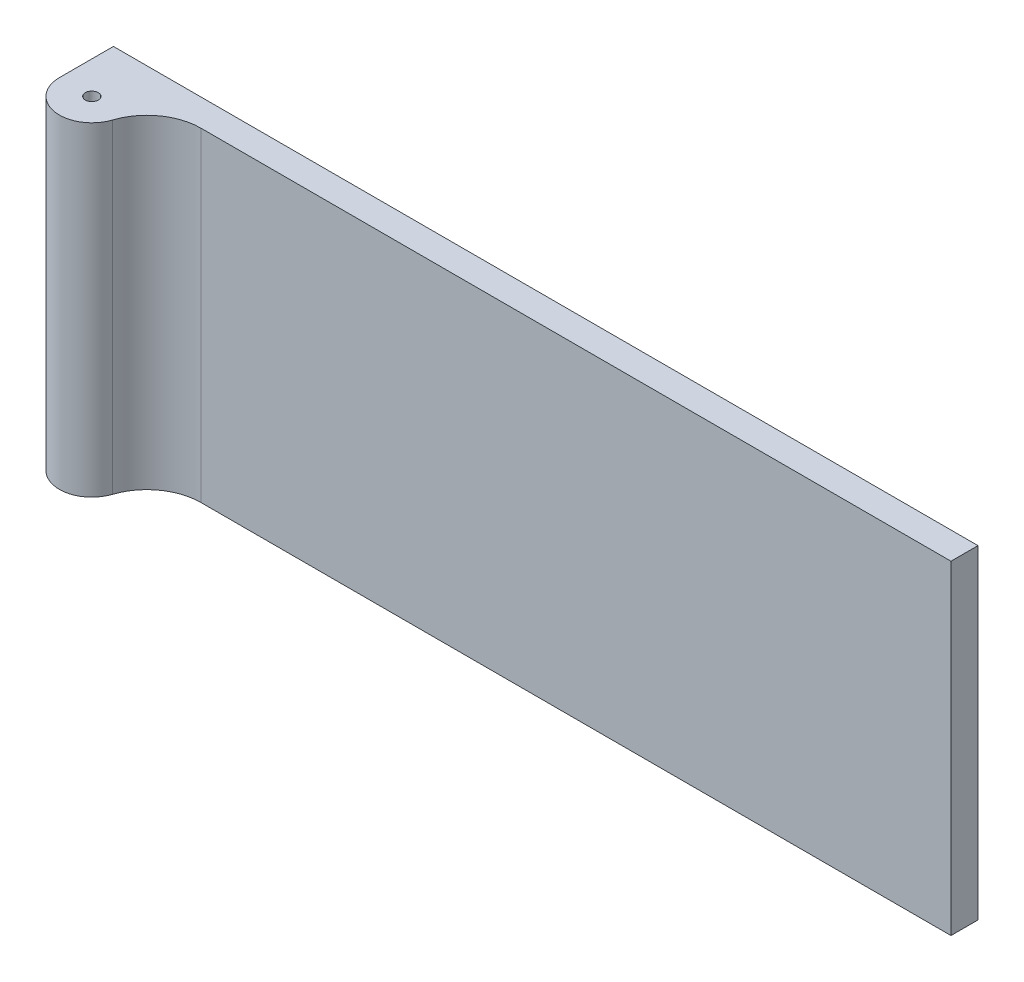
ISO-10303-21;
HEADER;
FILE_DESCRIPTION(('STEP AP214'),'2;1');
FILE_NAME('part.step','',(''),(''),'','','');
FILE_SCHEMA(('AUTOMOTIVE_DESIGN { 1 0 10303 214 1 1 1 1 }'));
ENDSEC;
DATA;
#1=APPLICATION_CONTEXT('core data for automotive mechanical design processes');
#2=APPLICATION_PROTOCOL_DEFINITION('international standard','automotive_design',2000,#1);
#3=PRODUCT_CONTEXT('',#1,'mechanical');
#4=PRODUCT('Part','Part','',(#3));
#5=PRODUCT_RELATED_PRODUCT_CATEGORY('part','',(#4));
#6=PRODUCT_DEFINITION_FORMATION('','',#4);
#7=PRODUCT_DEFINITION_CONTEXT('part definition',#1,'design');
#8=PRODUCT_DEFINITION('design','',#6,#7);
#9=PRODUCT_DEFINITION_SHAPE('','',#8);
#10=(LENGTH_UNIT() NAMED_UNIT(*) SI_UNIT(.MILLI.,.METRE.));
#11=(NAMED_UNIT(*) PLANE_ANGLE_UNIT() SI_UNIT($,.RADIAN.));
#12=(NAMED_UNIT(*) SI_UNIT($,.STERADIAN.) SOLID_ANGLE_UNIT());
#13=UNCERTAINTY_MEASURE_WITH_UNIT(LENGTH_MEASURE(1.E-05),#10,'distance_accuracy_value','');
#14=(GEOMETRIC_REPRESENTATION_CONTEXT(3) GLOBAL_UNCERTAINTY_ASSIGNED_CONTEXT((#13)) GLOBAL_UNIT_ASSIGNED_CONTEXT((#10,
#11,#12)) REPRESENTATION_CONTEXT('',''));
#15=CARTESIAN_POINT('',(0.,0.,0.));
#16=DIRECTION('',(0.,0.,1.));
#17=DIRECTION('',(1.,0.,0.));
#18=AXIS2_PLACEMENT_3D('',#15,#16,#17);
#19=CARTESIAN_POINT('',(0.,30.,0.));
#20=DIRECTION('',(1.,0.,0.));
#21=DIRECTION('',(0.,0.,-1.));
#22=AXIS2_PLACEMENT_3D('',#19,#20,#21);
#23=PLANE('',#22);
#24=DIRECTION('',(0.,0.,1.));
#25=VECTOR('',#24,1.);
#26=CARTESIAN_POINT('',(0.,0.,0.));
#27=LINE('',#26,#25);
#28=CARTESIAN_POINT('',(0.,0.,0.));
#29=VERTEX_POINT('',#28);
#30=CARTESIAN_POINT('',(0.,0.,5.));
#31=VERTEX_POINT('',#30);
#32=EDGE_CURVE('E106',#29,#31,#27,.T.);
#33=ORIENTED_EDGE('',*,*,#32,.T.);
#34=DIRECTION('',(0.,-1.,0.));
#35=VECTOR('',#34,1.);
#36=CARTESIAN_POINT('',(0.,30.,5.));
#37=LINE('',#36,#35);
#38=CARTESIAN_POINT('',(0.,30.,5.));
#39=VERTEX_POINT('',#38);
#40=EDGE_CURVE('E88',#39,#31,#37,.T.);
#41=ORIENTED_EDGE('',*,*,#40,.F.);
#42=DIRECTION('',(0.,0.,1.));
#43=VECTOR('',#42,1.);
#44=CARTESIAN_POINT('',(0.,30.,0.));
#45=LINE('',#44,#43);
#46=CARTESIAN_POINT('',(0.,30.,0.));
#47=VERTEX_POINT('',#46);
#48=EDGE_CURVE('E93',#47,#39,#45,.T.);
#49=ORIENTED_EDGE('',*,*,#48,.F.);
#50=DIRECTION('',(0.,-1.,0.));
#51=VECTOR('',#50,1.);
#52=CARTESIAN_POINT('',(0.,30.,0.));
#53=LINE('',#52,#51);
#54=EDGE_CURVE('E118',#47,#29,#53,.T.);
#55=ORIENTED_EDGE('',*,*,#54,.T.);
#56=EDGE_LOOP('',(#33,#41,#49,#55));
#57=FACE_BOUND('',#56,.T.);
#58=ADVANCED_FACE('F35',(#57),#23,.F.);
#59=CARTESIAN_POINT('',(3.,30.,5.));
#60=DIRECTION('',(0.,-1.,0.));
#61=DIRECTION('',(0.,0.,-1.));
#62=AXIS2_PLACEMENT_3D('',#59,#60,#61);
#63=CYLINDRICAL_SURFACE('',#62,3.);
#64=CARTESIAN_POINT('',(3.,0.,5.));
#65=DIRECTION('',(0.,1.,0.));
#66=DIRECTION('',(0.,0.,1.));
#67=AXIS2_PLACEMENT_3D('',#64,#65,#66);
#68=CIRCLE('',#67,3.);
#69=CARTESIAN_POINT('',(5.8497532787945,0.,5.9375));
#70=VERTEX_POINT('',#69);
#71=EDGE_CURVE('E131',#31,#70,#68,.T.);
#72=ORIENTED_EDGE('',*,*,#71,.T.);
#73=DIRECTION('',(0.,-1.,0.));
#74=VECTOR('',#73,1.);
#75=CARTESIAN_POINT('',(5.8497532787945,30.,5.9375));
#76=LINE('',#75,#74);
#77=CARTESIAN_POINT('',(5.8497532787945,30.,5.9375));
#78=VERTEX_POINT('',#77);
#79=EDGE_CURVE('E50',#70,#78,#76,.F.);
#80=ORIENTED_EDGE('',*,*,#79,.T.);
#81=CARTESIAN_POINT('',(3.,30.,5.));
#82=DIRECTION('',(0.,1.,0.));
#83=DIRECTION('',(0.,0.,1.));
#84=AXIS2_PLACEMENT_3D('',#81,#82,#83);
#85=CIRCLE('',#84,3.);
#86=EDGE_CURVE('E84',#39,#78,#85,.T.);
#87=ORIENTED_EDGE('',*,*,#86,.F.);
#88=ORIENTED_EDGE('',*,*,#40,.T.);
#89=EDGE_LOOP('',(#72,#80,#87,#88));
#90=FACE_BOUND('',#89,.T.);
#91=ADVANCED_FACE('F86',(#90),#63,.T.);
#92=CARTESIAN_POINT('',(0.,30.,2.5));
#93=DIRECTION('',(0.,0.,-1.));
#94=DIRECTION('',(-1.,0.,0.));
#95=AXIS2_PLACEMENT_3D('',#92,#93,#94);
#96=PLANE('',#95);
#97=DIRECTION('',(1.,0.,0.));
#98=VECTOR('',#97,1.);
#99=CARTESIAN_POINT('',(0.,30.,2.5));
#100=LINE('',#99,#98);
#101=CARTESIAN_POINT('',(10.5993420767853,30.,2.5));
#102=VERTEX_POINT('',#101);
#103=CARTESIAN_POINT('',(80.,30.,2.5));
#104=VERTEX_POINT('',#103);
#105=EDGE_CURVE('E92',#102,#104,#100,.T.);
#106=ORIENTED_EDGE('',*,*,#105,.F.);
#107=DIRECTION('',(0.,1.,0.));
#108=VECTOR('',#107,1.);
#109=CARTESIAN_POINT('',(10.5993420767853,0.,2.5));
#110=LINE('',#109,#108);
#111=CARTESIAN_POINT('',(10.5993420767853,0.,2.5));
#112=VERTEX_POINT('',#111);
#113=EDGE_CURVE('E107',#102,#112,#110,.F.);
#114=ORIENTED_EDGE('',*,*,#113,.T.);
#115=DIRECTION('',(1.,0.,0.));
#116=VECTOR('',#115,1.);
#117=CARTESIAN_POINT('',(0.,0.,2.5));
#118=LINE('',#117,#116);
#119=CARTESIAN_POINT('',(80.,0.,2.5));
#120=VERTEX_POINT('',#119);
#121=EDGE_CURVE('E129',#112,#120,#118,.T.);
#122=ORIENTED_EDGE('',*,*,#121,.T.);
#123=DIRECTION('',(0.,-1.,0.));
#124=VECTOR('',#123,1.);
#125=CARTESIAN_POINT('',(80.,30.,2.5));
#126=LINE('',#125,#124);
#127=EDGE_CURVE('E108',#104,#120,#126,.T.);
#128=ORIENTED_EDGE('',*,*,#127,.F.);
#129=EDGE_LOOP('',(#106,#114,#122,#128));
#130=FACE_BOUND('',#129,.T.);
#131=ADVANCED_FACE('F144',(#130),#96,.F.);
#132=CARTESIAN_POINT('',(80.,30.,0.));
#133=DIRECTION('',(1.,0.,0.));
#134=DIRECTION('',(0.,0.,-1.));
#135=AXIS2_PLACEMENT_3D('',#132,#133,#134);
#136=PLANE('',#135);
#137=DIRECTION('',(0.,0.,1.));
#138=VECTOR('',#137,1.);
#139=CARTESIAN_POINT('',(80.,0.,0.));
#140=LINE('',#139,#138);
#141=CARTESIAN_POINT('',(80.,0.,0.));
#142=VERTEX_POINT('',#141);
#143=EDGE_CURVE('E126',#142,#120,#140,.T.);
#144=ORIENTED_EDGE('',*,*,#143,.F.);
#145=DIRECTION('',(0.,-1.,0.));
#146=VECTOR('',#145,1.);
#147=CARTESIAN_POINT('',(80.,30.,0.));
#148=LINE('',#147,#146);
#149=CARTESIAN_POINT('',(80.,30.,0.));
#150=VERTEX_POINT('',#149);
#151=EDGE_CURVE('E113',#150,#142,#148,.T.);
#152=ORIENTED_EDGE('',*,*,#151,.F.);
#153=DIRECTION('',(0.,0.,1.));
#154=VECTOR('',#153,1.);
#155=CARTESIAN_POINT('',(80.,30.,0.));
#156=LINE('',#155,#154);
#157=EDGE_CURVE('E137',#150,#104,#156,.T.);
#158=ORIENTED_EDGE('',*,*,#157,.T.);
#159=ORIENTED_EDGE('',*,*,#127,.T.);
#160=EDGE_LOOP('',(#144,#152,#158,#159));
#161=FACE_BOUND('',#160,.T.);
#162=ADVANCED_FACE('F147',(#161),#136,.T.);
#163=CARTESIAN_POINT('',(0.,30.,0.));
#164=DIRECTION('',(0.,0.,-1.));
#165=DIRECTION('',(-1.,0.,0.));
#166=AXIS2_PLACEMENT_3D('',#163,#164,#165);
#167=PLANE('',#166);
#168=DIRECTION('',(1.,0.,0.));
#169=VECTOR('',#168,1.);
#170=CARTESIAN_POINT('',(0.,0.,0.));
#171=LINE('',#170,#169);
#172=EDGE_CURVE('E123',#29,#142,#171,.T.);
#173=ORIENTED_EDGE('',*,*,#172,.F.);
#174=ORIENTED_EDGE('',*,*,#54,.F.);
#175=DIRECTION('',(1.,0.,0.));
#176=VECTOR('',#175,1.);
#177=CARTESIAN_POINT('',(0.,30.,0.));
#178=LINE('',#177,#176);
#179=EDGE_CURVE('E101',#47,#150,#178,.T.);
#180=ORIENTED_EDGE('',*,*,#179,.T.);
#181=ORIENTED_EDGE('',*,*,#151,.T.);
#182=EDGE_LOOP('',(#173,#174,#180,#181));
#183=FACE_BOUND('',#182,.T.);
#184=ADVANCED_FACE('F150',(#183),#167,.T.);
#185=CARTESIAN_POINT('',(3.,30.,5.));
#186=DIRECTION('',(0.,-1.,0.));
#187=DIRECTION('',(0.,0.,-1.));
#188=AXIS2_PLACEMENT_3D('',#185,#186,#187);
#189=CYLINDRICAL_SURFACE('',#188,0.6);
#190=CARTESIAN_POINT('',(3.,30.,5.));
#191=DIRECTION('',(0.,1.,0.));
#192=DIRECTION('',(0.,0.,1.));
#193=AXIS2_PLACEMENT_3D('',#190,#191,#192);
#194=CIRCLE('',#193,0.6);
#195=CARTESIAN_POINT('',(3.,30.,5.6));
#196=VERTEX_POINT('',#195);
#197=EDGE_CURVE('E120',#196,#196,#194,.T.);
#198=ORIENTED_EDGE('',*,*,#197,.T.);
#199=EDGE_LOOP('',(#198));
#200=FACE_BOUND('',#199,.T.);
#201=CARTESIAN_POINT('',(3.,0.,5.));
#202=DIRECTION('',(0.,1.,0.));
#203=DIRECTION('',(0.,0.,1.));
#204=AXIS2_PLACEMENT_3D('',#201,#202,#203);
#205=CIRCLE('',#204,0.6);
#206=CARTESIAN_POINT('',(3.,0.,5.6));
#207=VERTEX_POINT('',#206);
#208=EDGE_CURVE('E103',#207,#207,#205,.T.);
#209=ORIENTED_EDGE('',*,*,#208,.F.);
#210=EDGE_LOOP('',(#209));
#211=FACE_BOUND('',#210,.T.);
#212=ADVANCED_FACE('F171',(#200,#211),#189,.F.);
#213=CARTESIAN_POINT('',(0.,30.,0.));
#214=DIRECTION('',(0.,1.,0.));
#215=DIRECTION('',(0.,0.,1.));
#216=AXIS2_PLACEMENT_3D('',#213,#214,#215);
#217=PLANE('',#216);
#218=ORIENTED_EDGE('',*,*,#48,.T.);
#219=ORIENTED_EDGE('',*,*,#86,.T.);
#220=CARTESIAN_POINT('',(10.5993420767853,30.,7.5));
#221=DIRECTION('',(0.,1.,0.));
#222=DIRECTION('',(0.,0.,1.));
#223=AXIS2_PLACEMENT_3D('',#220,#221,#222);
#224=CIRCLE('',#223,5.);
#225=EDGE_CURVE('E11',#78,#102,#224,.F.);
#226=ORIENTED_EDGE('',*,*,#225,.T.);
#227=ORIENTED_EDGE('',*,*,#105,.T.);
#228=ORIENTED_EDGE('',*,*,#157,.F.);
#229=ORIENTED_EDGE('',*,*,#179,.F.);
#230=EDGE_LOOP('',(#218,#219,#226,#227,#228,#229));
#231=FACE_BOUND('',#230,.T.);
#232=ORIENTED_EDGE('',*,*,#197,.F.);
#233=EDGE_LOOP('',(#232));
#234=FACE_BOUND('',#233,.T.);
#235=ADVANCED_FACE('F97',(#231,#234),#217,.T.);
#236=CARTESIAN_POINT('',(0.,0.,0.));
#237=DIRECTION('',(0.,1.,0.));
#238=DIRECTION('',(0.,0.,1.));
#239=AXIS2_PLACEMENT_3D('',#236,#237,#238);
#240=PLANE('',#239);
#241=ORIENTED_EDGE('',*,*,#32,.F.);
#242=ORIENTED_EDGE('',*,*,#172,.T.);
#243=ORIENTED_EDGE('',*,*,#143,.T.);
#244=ORIENTED_EDGE('',*,*,#121,.F.);
#245=CARTESIAN_POINT('',(10.5993420767853,0.,7.5));
#246=DIRECTION('',(0.,1.,0.));
#247=DIRECTION('',(0.,0.,1.));
#248=AXIS2_PLACEMENT_3D('',#245,#246,#247);
#249=CIRCLE('',#248,5.);
#250=EDGE_CURVE('E43',#112,#70,#249,.T.);
#251=ORIENTED_EDGE('',*,*,#250,.T.);
#252=ORIENTED_EDGE('',*,*,#71,.F.);
#253=EDGE_LOOP('',(#241,#242,#243,#244,#251,#252));
#254=FACE_BOUND('',#253,.T.);
#255=ORIENTED_EDGE('',*,*,#208,.T.);
#256=EDGE_LOOP('',(#255));
#257=FACE_BOUND('',#256,.T.);
#258=ADVANCED_FACE('F151',(#254,#257),#240,.F.);
#259=CARTESIAN_POINT('',(10.5993420767853,30.,7.5));
#260=DIRECTION('',(0.,-1.,0.));
#261=DIRECTION('',(0.,0.,-1.));
#262=AXIS2_PLACEMENT_3D('',#259,#260,#261);
#263=CYLINDRICAL_SURFACE('',#262,5.);
#264=ORIENTED_EDGE('',*,*,#225,.F.);
#265=ORIENTED_EDGE('',*,*,#79,.F.);
#266=ORIENTED_EDGE('',*,*,#250,.F.);
#267=ORIENTED_EDGE('',*,*,#113,.F.);
#268=EDGE_LOOP('',(#264,#265,#266,#267));
#269=FACE_BOUND('',#268,.T.);
#270=ADVANCED_FACE('F37',(#269),#263,.F.);
#271=CLOSED_SHELL('',(#58,#91,#131,#162,#184,#212,#235,#258,#270));
#272=MANIFOLD_SOLID_BREP('B2',#271);
#273=ADVANCED_BREP_SHAPE_REPRESENTATION('',(#18,#272),#14);
#274=SHAPE_DEFINITION_REPRESENTATION(#9,#273);
ENDSEC;
END-ISO-10303-21;
